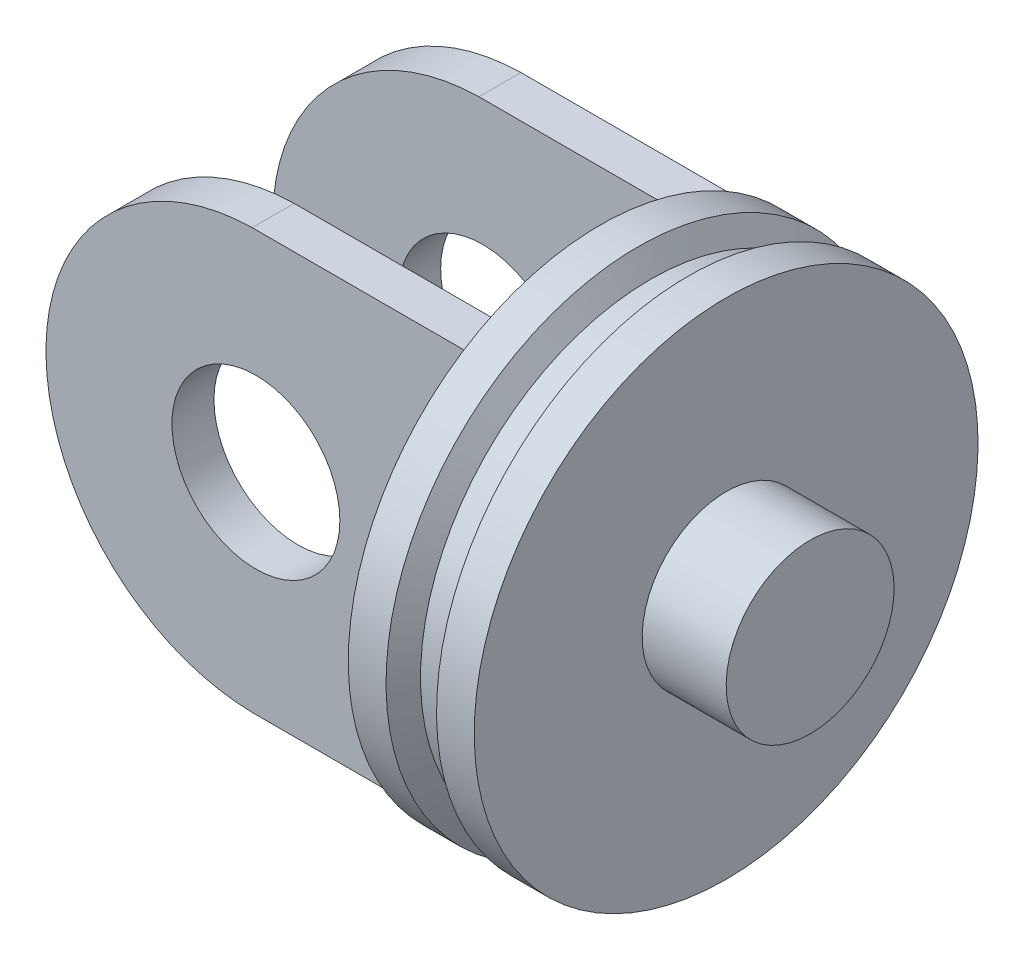
ISO-10303-21;
HEADER;
FILE_DESCRIPTION(('STEP AP214'),'2;1');
FILE_NAME('part.step','',(''),(''),'','','');
FILE_SCHEMA(('AUTOMOTIVE_DESIGN { 1 0 10303 214 1 1 1 1 }'));
ENDSEC;
DATA;
#1=APPLICATION_CONTEXT('core data for automotive mechanical design processes');
#2=APPLICATION_PROTOCOL_DEFINITION('international standard','automotive_design',2000,#1);
#3=PRODUCT_CONTEXT('',#1,'mechanical');
#4=PRODUCT('Part','Part','',(#3));
#5=PRODUCT_RELATED_PRODUCT_CATEGORY('part','',(#4));
#6=PRODUCT_DEFINITION_FORMATION('','',#4);
#7=PRODUCT_DEFINITION_CONTEXT('part definition',#1,'design');
#8=PRODUCT_DEFINITION('design','',#6,#7);
#9=PRODUCT_DEFINITION_SHAPE('','',#8);
#10=(LENGTH_UNIT() NAMED_UNIT(*) SI_UNIT(.MILLI.,.METRE.));
#11=(NAMED_UNIT(*) PLANE_ANGLE_UNIT() SI_UNIT($,.RADIAN.));
#12=(NAMED_UNIT(*) SI_UNIT($,.STERADIAN.) SOLID_ANGLE_UNIT());
#13=UNCERTAINTY_MEASURE_WITH_UNIT(LENGTH_MEASURE(1.E-05),#10,'distance_accuracy_value','');
#14=(GEOMETRIC_REPRESENTATION_CONTEXT(3) GLOBAL_UNCERTAINTY_ASSIGNED_CONTEXT((#13)) GLOBAL_UNIT_ASSIGNED_CONTEXT((#10,
#11,#12)) REPRESENTATION_CONTEXT('',''));
#15=CARTESIAN_POINT('',(0.,0.,0.));
#16=DIRECTION('',(0.,0.,1.));
#17=DIRECTION('',(1.,0.,0.));
#18=AXIS2_PLACEMENT_3D('',#15,#16,#17);
#19=CARTESIAN_POINT('',(-28.75,-12.5,0.));
#20=DIRECTION('',(0.,1.,0.));
#21=DIRECTION('',(-1.,0.,0.));
#22=AXIS2_PLACEMENT_3D('',#19,#20,#21);
#23=PLANE('',#22);
#24=DIRECTION('',(0.,0.,1.));
#25=VECTOR('',#24,1.);
#26=CARTESIAN_POINT('',(-16.4697197970867,-12.5,-17.));
#27=LINE('',#26,#25);
#28=CARTESIAN_POINT('',(-16.4697197970867,-12.5,-8.));
#29=VERTEX_POINT('',#28);
#30=CARTESIAN_POINT('',(-16.4697197970867,-12.5,-5.5));
#31=VERTEX_POINT('',#30);
#32=EDGE_CURVE('E165',#29,#31,#27,.T.);
#33=ORIENTED_EDGE('',*,*,#32,.F.);
#34=DIRECTION('',(1.,0.,0.));
#35=VECTOR('',#34,1.);
#36=CARTESIAN_POINT('',(-28.75,-12.5,-8.));
#37=LINE('',#36,#35);
#38=CARTESIAN_POINT('',(-3.75,-12.5,-8.));
#39=VERTEX_POINT('',#38);
#40=EDGE_CURVE('E199',#29,#39,#37,.T.);
#41=ORIENTED_EDGE('',*,*,#40,.T.);
#42=DIRECTION('',(0.,0.,1.));
#43=VECTOR('',#42,1.);
#44=CARTESIAN_POINT('',(-3.75,-12.5,0.));
#45=LINE('',#44,#43);
#46=CARTESIAN_POINT('',(-3.75,-12.5,-5.5));
#47=VERTEX_POINT('',#46);
#48=EDGE_CURVE('E186',#39,#47,#45,.T.);
#49=ORIENTED_EDGE('',*,*,#48,.T.);
#50=DIRECTION('',(1.,0.,0.));
#51=VECTOR('',#50,1.);
#52=CARTESIAN_POINT('',(-28.75,-12.5,-5.5));
#53=LINE('',#52,#51);
#54=EDGE_CURVE('E215',#31,#47,#53,.T.);
#55=ORIENTED_EDGE('',*,*,#54,.F.);
#56=EDGE_LOOP('',(#33,#41,#49,#55));
#57=FACE_BOUND('',#56,.T.);
#58=ADVANCED_FACE('F67',(#57),#23,.F.);
#59=CARTESIAN_POINT('',(-28.75,0.,-5.5));
#60=DIRECTION('',(0.,0.,-1.));
#61=DIRECTION('',(-1.,0.,0.));
#62=AXIS2_PLACEMENT_3D('',#59,#60,#61);
#63=PLANE('',#62);
#64=CARTESIAN_POINT('',(-16.25,0.,-5.5));
#65=DIRECTION('',(0.,0.,-1.));
#66=DIRECTION('',(-1.,0.,0.));
#67=AXIS2_PLACEMENT_3D('',#64,#65,#66);
#68=CIRCLE('',#67,5.);
#69=CARTESIAN_POINT('',(-21.25,0.,-5.5));
#70=VERTEX_POINT('',#69);
#71=EDGE_CURVE('E271',#70,#70,#68,.T.);
#72=ORIENTED_EDGE('',*,*,#71,.T.);
#73=EDGE_LOOP('',(#72));
#74=FACE_BOUND('',#73,.T.);
#75=CARTESIAN_POINT('',(-16.25,0.,-5.5));
#76=DIRECTION('',(0.,0.,-1.));
#77=DIRECTION('',(-1.,0.,0.));
#78=AXIS2_PLACEMENT_3D('',#75,#76,#77);
#79=CIRCLE('',#78,12.5019309224308);
#80=CARTESIAN_POINT('',(-28.75,-0.219719797086722,-5.5));
#81=VERTEX_POINT('',#80);
#82=EDGE_CURVE('E91',#31,#81,#79,.T.);
#83=ORIENTED_EDGE('',*,*,#82,.F.);
#84=ORIENTED_EDGE('',*,*,#54,.T.);
#85=DIRECTION('',(0.,1.,0.));
#86=VECTOR('',#85,1.);
#87=CARTESIAN_POINT('',(-3.75,0.,-5.5));
#88=LINE('',#87,#86);
#89=CARTESIAN_POINT('',(-3.75,12.5,-5.5));
#90=VERTEX_POINT('',#89);
#91=EDGE_CURVE('E202',#47,#90,#88,.T.);
#92=ORIENTED_EDGE('',*,*,#91,.T.);
#93=DIRECTION('',(1.,0.,0.));
#94=VECTOR('',#93,1.);
#95=CARTESIAN_POINT('',(-28.75,12.5,-5.5));
#96=LINE('',#95,#94);
#97=CARTESIAN_POINT('',(-16.4697197970872,12.5,-5.5));
#98=VERTEX_POINT('',#97);
#99=EDGE_CURVE('E213',#98,#90,#96,.T.);
#100=ORIENTED_EDGE('',*,*,#99,.F.);
#101=CARTESIAN_POINT('',(-16.25,0.,-5.5));
#102=DIRECTION('',(0.,0.,-1.));
#103=DIRECTION('',(-1.,0.,0.));
#104=AXIS2_PLACEMENT_3D('',#101,#102,#103);
#105=CIRCLE('',#104,12.5019309224308);
#106=CARTESIAN_POINT('',(-28.75,0.219719797086724,-5.5));
#107=VERTEX_POINT('',#106);
#108=EDGE_CURVE('E298',#107,#98,#105,.T.);
#109=ORIENTED_EDGE('',*,*,#108,.F.);
#110=DIRECTION('',(0.,1.,0.));
#111=VECTOR('',#110,1.);
#112=CARTESIAN_POINT('',(-28.75,0.,-5.5));
#113=LINE('',#112,#111);
#114=EDGE_CURVE('E192',#81,#107,#113,.T.);
#115=ORIENTED_EDGE('',*,*,#114,.F.);
#116=EDGE_LOOP('',(#83,#84,#92,#100,#109,#115));
#117=FACE_BOUND('',#116,.T.);
#118=ADVANCED_FACE('F314',(#74,#117),#63,.F.);
#119=CARTESIAN_POINT('',(-28.75,12.5,0.));
#120=DIRECTION('',(0.,1.,0.));
#121=DIRECTION('',(-1.,0.,0.));
#122=AXIS2_PLACEMENT_3D('',#119,#120,#121);
#123=PLANE('',#122);
#124=DIRECTION('',(1.,0.,0.));
#125=VECTOR('',#124,1.);
#126=CARTESIAN_POINT('',(-28.75,12.5,-8.));
#127=LINE('',#126,#125);
#128=CARTESIAN_POINT('',(-16.4697197970872,12.5,-8.));
#129=VERTEX_POINT('',#128);
#130=CARTESIAN_POINT('',(-3.75,12.5,-8.));
#131=VERTEX_POINT('',#130);
#132=EDGE_CURVE('E211',#129,#131,#127,.T.);
#133=ORIENTED_EDGE('',*,*,#132,.F.);
#134=DIRECTION('',(0.,0.,1.));
#135=VECTOR('',#134,1.);
#136=CARTESIAN_POINT('',(-16.4697197970872,12.5,-17.));
#137=LINE('',#136,#135);
#138=EDGE_CURVE('E290',#129,#98,#137,.T.);
#139=ORIENTED_EDGE('',*,*,#138,.T.);
#140=ORIENTED_EDGE('',*,*,#99,.T.);
#141=DIRECTION('',(0.,0.,1.));
#142=VECTOR('',#141,1.);
#143=CARTESIAN_POINT('',(-3.75,12.5,0.));
#144=LINE('',#143,#142);
#145=EDGE_CURVE('E205',#131,#90,#144,.T.);
#146=ORIENTED_EDGE('',*,*,#145,.F.);
#147=EDGE_LOOP('',(#133,#139,#140,#146));
#148=FACE_BOUND('',#147,.T.);
#149=ADVANCED_FACE('F336',(#148),#123,.T.);
#150=CARTESIAN_POINT('',(-28.75,0.,-8.));
#151=DIRECTION('',(0.,0.,-1.));
#152=DIRECTION('',(-1.,0.,0.));
#153=AXIS2_PLACEMENT_3D('',#150,#151,#152);
#154=PLANE('',#153);
#155=CARTESIAN_POINT('',(-16.25,0.,-8.));
#156=DIRECTION('',(0.,0.,-1.));
#157=DIRECTION('',(-1.,0.,0.));
#158=AXIS2_PLACEMENT_3D('',#155,#156,#157);
#159=CIRCLE('',#158,5.);
#160=CARTESIAN_POINT('',(-21.25,0.,-8.));
#161=VERTEX_POINT('',#160);
#162=EDGE_CURVE('E307',#161,#161,#159,.T.);
#163=ORIENTED_EDGE('',*,*,#162,.F.);
#164=EDGE_LOOP('',(#163));
#165=FACE_BOUND('',#164,.T.);
#166=ORIENTED_EDGE('',*,*,#40,.F.);
#167=CARTESIAN_POINT('',(-16.25,0.,-8.));
#168=DIRECTION('',(0.,0.,-1.));
#169=DIRECTION('',(-1.,0.,0.));
#170=AXIS2_PLACEMENT_3D('',#167,#168,#169);
#171=CIRCLE('',#170,12.5019309224308);
#172=CARTESIAN_POINT('',(-28.75,-0.219719797086722,-8.));
#173=VERTEX_POINT('',#172);
#174=EDGE_CURVE('E301',#29,#173,#171,.T.);
#175=ORIENTED_EDGE('',*,*,#174,.T.);
#176=DIRECTION('',(0.,1.,0.));
#177=VECTOR('',#176,1.);
#178=CARTESIAN_POINT('',(-28.75,0.,-8.));
#179=LINE('',#178,#177);
#180=CARTESIAN_POINT('',(-28.75,0.219719797086724,-8.));
#181=VERTEX_POINT('',#180);
#182=EDGE_CURVE('E195',#173,#181,#179,.T.);
#183=ORIENTED_EDGE('',*,*,#182,.T.);
#184=CARTESIAN_POINT('',(-16.25,0.,-8.));
#185=DIRECTION('',(0.,0.,-1.));
#186=DIRECTION('',(-1.,0.,0.));
#187=AXIS2_PLACEMENT_3D('',#184,#185,#186);
#188=CIRCLE('',#187,12.5019309224308);
#189=EDGE_CURVE('E83',#181,#129,#188,.T.);
#190=ORIENTED_EDGE('',*,*,#189,.T.);
#191=ORIENTED_EDGE('',*,*,#132,.T.);
#192=DIRECTION('',(0.,1.,0.));
#193=VECTOR('',#192,1.);
#194=CARTESIAN_POINT('',(-3.75,0.,-8.));
#195=LINE('',#194,#193);
#196=EDGE_CURVE('E196',#39,#131,#195,.T.);
#197=ORIENTED_EDGE('',*,*,#196,.F.);
#198=EDGE_LOOP('',(#166,#175,#183,#190,#191,#197));
#199=FACE_BOUND('',#198,.T.);
#200=ADVANCED_FACE('F455',(#165,#199),#154,.T.);
#201=CARTESIAN_POINT('',(-28.75,0.,0.));
#202=DIRECTION('',(-1.,0.,0.));
#203=DIRECTION('',(0.,-1.,0.));
#204=AXIS2_PLACEMENT_3D('',#201,#202,#203);
#205=PLANE('',#204);
#206=ORIENTED_EDGE('',*,*,#182,.F.);
#207=DIRECTION('',(0.,0.,1.));
#208=VECTOR('',#207,1.);
#209=CARTESIAN_POINT('',(-28.75,-0.219719797086722,-17.));
#210=LINE('',#209,#208);
#211=EDGE_CURVE('E166',#173,#81,#210,.T.);
#212=ORIENTED_EDGE('',*,*,#211,.T.);
#213=ORIENTED_EDGE('',*,*,#114,.T.);
#214=DIRECTION('',(0.,0.,1.));
#215=VECTOR('',#214,1.);
#216=CARTESIAN_POINT('',(-28.75,0.219719797086724,-17.));
#217=LINE('',#216,#215);
#218=EDGE_CURVE('E294',#181,#107,#217,.T.);
#219=ORIENTED_EDGE('',*,*,#218,.F.);
#220=EDGE_LOOP('',(#206,#212,#213,#219));
#221=FACE_BOUND('',#220,.T.);
#222=ADVANCED_FACE('F464',(#221),#205,.T.);
#223=CARTESIAN_POINT('',(-28.75,0.,5.5));
#224=DIRECTION('',(0.,0.,-1.));
#225=DIRECTION('',(-1.,0.,0.));
#226=AXIS2_PLACEMENT_3D('',#223,#224,#225);
#227=PLANE('',#226);
#228=CARTESIAN_POINT('',(-16.25,0.,5.5));
#229=DIRECTION('',(0.,0.,-1.));
#230=DIRECTION('',(-1.,0.,0.));
#231=AXIS2_PLACEMENT_3D('',#228,#229,#230);
#232=CIRCLE('',#231,5.);
#233=CARTESIAN_POINT('',(-21.25,0.,5.5));
#234=VERTEX_POINT('',#233);
#235=EDGE_CURVE('E305',#234,#234,#232,.T.);
#236=ORIENTED_EDGE('',*,*,#235,.F.);
#237=EDGE_LOOP('',(#236));
#238=FACE_BOUND('',#237,.T.);
#239=DIRECTION('',(1.,0.,0.));
#240=VECTOR('',#239,1.);
#241=CARTESIAN_POINT('',(-28.75,-12.5,5.5));
#242=LINE('',#241,#240);
#243=CARTESIAN_POINT('',(-16.4697197970867,-12.5,5.50000000000001));
#244=VERTEX_POINT('',#243);
#245=CARTESIAN_POINT('',(-3.75,-12.5,5.5));
#246=VERTEX_POINT('',#245);
#247=EDGE_CURVE('E183',#244,#246,#242,.T.);
#248=ORIENTED_EDGE('',*,*,#247,.F.);
#249=CARTESIAN_POINT('',(-16.25,0.,5.5));
#250=DIRECTION('',(0.,0.,-1.));
#251=DIRECTION('',(-1.,0.,0.));
#252=AXIS2_PLACEMENT_3D('',#249,#250,#251);
#253=CIRCLE('',#252,12.5019309224308);
#254=CARTESIAN_POINT('',(-28.75,-0.219719797086722,5.50000000000001));
#255=VERTEX_POINT('',#254);
#256=EDGE_CURVE('E161',#244,#255,#253,.T.);
#257=ORIENTED_EDGE('',*,*,#256,.T.);
#258=DIRECTION('',(0.,1.,0.));
#259=VECTOR('',#258,1.);
#260=CARTESIAN_POINT('',(-28.75,0.,5.5));
#261=LINE('',#260,#259);
#262=CARTESIAN_POINT('',(-28.75,0.219719797086724,5.5));
#263=VERTEX_POINT('',#262);
#264=EDGE_CURVE('E257',#255,#263,#261,.T.);
#265=ORIENTED_EDGE('',*,*,#264,.T.);
#266=CARTESIAN_POINT('',(-16.25,0.,5.5));
#267=DIRECTION('',(0.,0.,-1.));
#268=DIRECTION('',(-1.,0.,0.));
#269=AXIS2_PLACEMENT_3D('',#266,#267,#268);
#270=CIRCLE('',#269,12.5019309224308);
#271=CARTESIAN_POINT('',(-16.4697197970872,12.5,5.50000000000001));
#272=VERTEX_POINT('',#271);
#273=EDGE_CURVE('E262',#263,#272,#270,.T.);
#274=ORIENTED_EDGE('',*,*,#273,.T.);
#275=DIRECTION('',(1.,0.,0.));
#276=VECTOR('',#275,1.);
#277=CARTESIAN_POINT('',(-28.75,12.5,5.5));
#278=LINE('',#277,#276);
#279=CARTESIAN_POINT('',(-3.75,12.5,5.5));
#280=VERTEX_POINT('',#279);
#281=EDGE_CURVE('E188',#272,#280,#278,.T.);
#282=ORIENTED_EDGE('',*,*,#281,.T.);
#283=DIRECTION('',(0.,1.,0.));
#284=VECTOR('',#283,1.);
#285=CARTESIAN_POINT('',(-3.75,0.,5.5));
#286=LINE('',#285,#284);
#287=EDGE_CURVE('E274',#246,#280,#286,.T.);
#288=ORIENTED_EDGE('',*,*,#287,.F.);
#289=EDGE_LOOP('',(#248,#257,#265,#274,#282,#288));
#290=FACE_BOUND('',#289,.T.);
#291=ADVANCED_FACE('F261',(#238,#290),#227,.T.);
#292=CARTESIAN_POINT('',(-28.75,-12.5,0.));
#293=DIRECTION('',(0.,-1.,0.));
#294=DIRECTION('',(1.,0.,0.));
#295=AXIS2_PLACEMENT_3D('',#292,#293,#294);
#296=PLANE('',#295);
#297=DIRECTION('',(1.,0.,0.));
#298=VECTOR('',#297,1.);
#299=CARTESIAN_POINT('',(-28.75,-12.5,8.));
#300=LINE('',#299,#298);
#301=CARTESIAN_POINT('',(-16.4697197970867,-12.5,8.));
#302=VERTEX_POINT('',#301);
#303=CARTESIAN_POINT('',(-3.75,-12.5,8.));
#304=VERTEX_POINT('',#303);
#305=EDGE_CURVE('E172',#302,#304,#300,.T.);
#306=ORIENTED_EDGE('',*,*,#305,.F.);
#307=EDGE_CURVE('E156',#244,#302,#27,.T.);
#308=ORIENTED_EDGE('',*,*,#307,.F.);
#309=ORIENTED_EDGE('',*,*,#247,.T.);
#310=DIRECTION('',(0.,0.,-1.));
#311=VECTOR('',#310,1.);
#312=CARTESIAN_POINT('',(-3.75,-12.5,0.));
#313=LINE('',#312,#311);
#314=EDGE_CURVE('E181',#304,#246,#313,.T.);
#315=ORIENTED_EDGE('',*,*,#314,.F.);
#316=EDGE_LOOP('',(#306,#308,#309,#315));
#317=FACE_BOUND('',#316,.T.);
#318=ADVANCED_FACE('F179',(#317),#296,.T.);
#319=CARTESIAN_POINT('',(-28.75,0.,8.));
#320=DIRECTION('',(0.,0.,-1.));
#321=DIRECTION('',(-1.,0.,0.));
#322=AXIS2_PLACEMENT_3D('',#319,#320,#321);
#323=PLANE('',#322);
#324=CARTESIAN_POINT('',(-16.25,0.,8.));
#325=DIRECTION('',(0.,0.,1.));
#326=DIRECTION('',(1.,0.,0.));
#327=AXIS2_PLACEMENT_3D('',#324,#325,#326);
#328=CIRCLE('',#327,5.);
#329=CARTESIAN_POINT('',(-11.25,0.,8.));
#330=VERTEX_POINT('',#329);
#331=EDGE_CURVE('E177',#330,#330,#328,.T.);
#332=ORIENTED_EDGE('',*,*,#331,.F.);
#333=EDGE_LOOP('',(#332));
#334=FACE_BOUND('',#333,.T.);
#335=CARTESIAN_POINT('',(-16.25,0.,8.));
#336=DIRECTION('',(0.,0.,1.));
#337=DIRECTION('',(1.,0.,0.));
#338=AXIS2_PLACEMENT_3D('',#335,#336,#337);
#339=CIRCLE('',#338,12.5019309224308);
#340=CARTESIAN_POINT('',(-28.75,-0.219719797086722,8.));
#341=VERTEX_POINT('',#340);
#342=EDGE_CURVE('E159',#341,#302,#339,.T.);
#343=ORIENTED_EDGE('',*,*,#342,.T.);
#344=ORIENTED_EDGE('',*,*,#305,.T.);
#345=DIRECTION('',(0.,1.,0.));
#346=VECTOR('',#345,1.);
#347=CARTESIAN_POINT('',(-3.75,0.,8.));
#348=LINE('',#347,#346);
#349=CARTESIAN_POINT('',(-3.75,12.5,8.));
#350=VERTEX_POINT('',#349);
#351=EDGE_CURVE('E268',#304,#350,#348,.T.);
#352=ORIENTED_EDGE('',*,*,#351,.T.);
#353=DIRECTION('',(1.,0.,0.));
#354=VECTOR('',#353,1.);
#355=CARTESIAN_POINT('',(-28.75,12.5,8.));
#356=LINE('',#355,#354);
#357=CARTESIAN_POINT('',(-16.4697197970872,12.5,8.));
#358=VERTEX_POINT('',#357);
#359=EDGE_CURVE('E184',#358,#350,#356,.T.);
#360=ORIENTED_EDGE('',*,*,#359,.F.);
#361=CARTESIAN_POINT('',(-16.25,0.,8.));
#362=DIRECTION('',(0.,0.,1.));
#363=DIRECTION('',(1.,0.,0.));
#364=AXIS2_PLACEMENT_3D('',#361,#362,#363);
#365=CIRCLE('',#364,12.5019309224308);
#366=CARTESIAN_POINT('',(-28.75,0.219719797086724,8.));
#367=VERTEX_POINT('',#366);
#368=EDGE_CURVE('E287',#358,#367,#365,.T.);
#369=ORIENTED_EDGE('',*,*,#368,.T.);
#370=DIRECTION('',(0.,1.,0.));
#371=VECTOR('',#370,1.);
#372=CARTESIAN_POINT('',(-28.75,0.,8.));
#373=LINE('',#372,#371);
#374=EDGE_CURVE('E176',#341,#367,#373,.T.);
#375=ORIENTED_EDGE('',*,*,#374,.F.);
#376=EDGE_LOOP('',(#343,#344,#352,#360,#369,#375));
#377=FACE_BOUND('',#376,.T.);
#378=ADVANCED_FACE('F170',(#334,#377),#323,.F.);
#379=CARTESIAN_POINT('',(-28.75,12.5,0.));
#380=DIRECTION('',(0.,-1.,0.));
#381=DIRECTION('',(1.,0.,0.));
#382=AXIS2_PLACEMENT_3D('',#379,#380,#381);
#383=PLANE('',#382);
#384=EDGE_CURVE('E288',#272,#358,#137,.T.);
#385=ORIENTED_EDGE('',*,*,#384,.T.);
#386=ORIENTED_EDGE('',*,*,#359,.T.);
#387=DIRECTION('',(0.,0.,-1.));
#388=VECTOR('',#387,1.);
#389=CARTESIAN_POINT('',(-3.75,12.5,0.));
#390=LINE('',#389,#388);
#391=EDGE_CURVE('E264',#350,#280,#390,.T.);
#392=ORIENTED_EDGE('',*,*,#391,.T.);
#393=ORIENTED_EDGE('',*,*,#281,.F.);
#394=EDGE_LOOP('',(#385,#386,#392,#393));
#395=FACE_BOUND('',#394,.T.);
#396=ADVANCED_FACE('F282',(#395),#383,.F.);
#397=CARTESIAN_POINT('',(-28.75,0.,0.));
#398=DIRECTION('',(-1.,0.,0.));
#399=DIRECTION('',(0.,-1.,0.));
#400=AXIS2_PLACEMENT_3D('',#397,#398,#399);
#401=PLANE('',#400);
#402=ORIENTED_EDGE('',*,*,#264,.F.);
#403=DIRECTION('',(0.,0.,1.));
#404=VECTOR('',#403,1.);
#405=CARTESIAN_POINT('',(-28.75,-0.219719797086722,-17.));
#406=LINE('',#405,#404);
#407=EDGE_CURVE('E12',#255,#341,#406,.T.);
#408=ORIENTED_EDGE('',*,*,#407,.T.);
#409=ORIENTED_EDGE('',*,*,#374,.T.);
#410=DIRECTION('',(0.,0.,1.));
#411=VECTOR('',#410,1.);
#412=CARTESIAN_POINT('',(-28.75,0.219719797086724,-17.));
#413=LINE('',#412,#411);
#414=EDGE_CURVE('E76',#367,#263,#413,.F.);
#415=ORIENTED_EDGE('',*,*,#414,.T.);
#416=EDGE_LOOP('',(#402,#408,#409,#415));
#417=FACE_BOUND('',#416,.T.);
#418=ADVANCED_FACE('F256',(#417),#401,.T.);
#419=CARTESIAN_POINT('',(-3.75,0.,0.));
#420=DIRECTION('',(-1.,0.,0.));
#421=DIRECTION('',(0.,-1.,0.));
#422=AXIS2_PLACEMENT_3D('',#419,#420,#421);
#423=PLANE('',#422);
#424=ORIENTED_EDGE('',*,*,#287,.T.);
#425=ORIENTED_EDGE('',*,*,#391,.F.);
#426=ORIENTED_EDGE('',*,*,#351,.F.);
#427=ORIENTED_EDGE('',*,*,#314,.T.);
#428=EDGE_LOOP('',(#424,#425,#426,#427));
#429=FACE_BOUND('',#428,.T.);
#430=CARTESIAN_POINT('',(-3.75,0.,0.));
#431=DIRECTION('',(-1.,0.,0.));
#432=DIRECTION('',(0.,-1.,0.));
#433=AXIS2_PLACEMENT_3D('',#430,#431,#432);
#434=CIRCLE('',#433,15.);
#435=CARTESIAN_POINT('',(-3.75,-15.,0.));
#436=VERTEX_POINT('',#435);
#437=EDGE_CURVE('E232',#436,#436,#434,.T.);
#438=ORIENTED_EDGE('',*,*,#437,.T.);
#439=EDGE_LOOP('',(#438));
#440=FACE_BOUND('',#439,.T.);
#441=ORIENTED_EDGE('',*,*,#91,.F.);
#442=ORIENTED_EDGE('',*,*,#48,.F.);
#443=ORIENTED_EDGE('',*,*,#196,.T.);
#444=ORIENTED_EDGE('',*,*,#145,.T.);
#445=EDGE_LOOP('',(#441,#442,#443,#444));
#446=FACE_BOUND('',#445,.T.);
#447=ADVANCED_FACE('F285',(#429,#440,#446),#423,.T.);
#448=CARTESIAN_POINT('',(-10.1043716212932,0.,0.));
#449=DIRECTION('',(-1.,0.,0.));
#450=DIRECTION('',(0.,-1.,0.));
#451=AXIS2_PLACEMENT_3D('',#448,#449,#450);
#452=CYLINDRICAL_SURFACE('',#451,13.6977938425588);
#453=CARTESIAN_POINT('',(0.751829075539095,0.,0.));
#454=DIRECTION('',(-1.,0.,0.));
#455=DIRECTION('',(0.,-1.,0.));
#456=AXIS2_PLACEMENT_3D('',#453,#454,#455);
#457=CIRCLE('',#456,13.6977938425588);
#458=CARTESIAN_POINT('',(0.751829075539096,-13.6977938425588,0.));
#459=VERTEX_POINT('',#458);
#460=EDGE_CURVE('E217',#459,#459,#457,.T.);
#461=ORIENTED_EDGE('',*,*,#460,.T.);
#462=EDGE_LOOP('',(#461));
#463=FACE_BOUND('',#462,.T.);
#464=CARTESIAN_POINT('',(-0.751829075539072,0.,0.));
#465=DIRECTION('',(-1.,0.,0.));
#466=DIRECTION('',(0.,-1.,0.));
#467=AXIS2_PLACEMENT_3D('',#464,#465,#466);
#468=CIRCLE('',#467,13.6977938425588);
#469=CARTESIAN_POINT('',(-0.751829075539071,-13.6977938425588,0.));
#470=VERTEX_POINT('',#469);
#471=EDGE_CURVE('E238',#470,#470,#468,.T.);
#472=ORIENTED_EDGE('',*,*,#471,.F.);
#473=EDGE_LOOP('',(#472));
#474=FACE_BOUND('',#473,.T.);
#475=ADVANCED_FACE('F365',(#463,#474),#452,.T.);
#476=CARTESIAN_POINT('',(-1.50365815107816,0.,0.));
#477=DIRECTION('',(-1.,0.,0.));
#478=DIRECTION('',(0.,-1.,0.));
#479=AXIS2_PLACEMENT_3D('',#476,#477,#478);
#480=CONICAL_SURFACE('',#479,15.,1.0471975511966);
#481=ORIENTED_EDGE('',*,*,#471,.T.);
#482=EDGE_LOOP('',(#481));
#483=FACE_BOUND('',#482,.T.);
#484=CARTESIAN_POINT('',(-1.50365815107816,0.,0.));
#485=DIRECTION('',(-1.,0.,0.));
#486=DIRECTION('',(0.,-1.,0.));
#487=AXIS2_PLACEMENT_3D('',#484,#485,#486);
#488=CIRCLE('',#487,15.);
#489=CARTESIAN_POINT('',(-1.50365815107816,-15.,0.));
#490=VERTEX_POINT('',#489);
#491=EDGE_CURVE('E235',#490,#490,#488,.T.);
#492=ORIENTED_EDGE('',*,*,#491,.F.);
#493=EDGE_LOOP('',(#492));
#494=FACE_BOUND('',#493,.T.);
#495=ADVANCED_FACE('F368',(#483,#494),#480,.T.);
#496=CARTESIAN_POINT('',(-10.1043716212932,0.,0.));
#497=DIRECTION('',(-1.,0.,0.));
#498=DIRECTION('',(0.,-1.,0.));
#499=AXIS2_PLACEMENT_3D('',#496,#497,#498);
#500=CYLINDRICAL_SURFACE('',#499,15.);
#501=ORIENTED_EDGE('',*,*,#491,.T.);
#502=EDGE_LOOP('',(#501));
#503=FACE_BOUND('',#502,.T.);
#504=ORIENTED_EDGE('',*,*,#437,.F.);
#505=EDGE_LOOP('',(#504));
#506=FACE_BOUND('',#505,.T.);
#507=ADVANCED_FACE('F361',(#503,#506),#500,.T.);
#508=CARTESIAN_POINT('',(8.75,0.,0.));
#509=DIRECTION('',(1.,0.,0.));
#510=DIRECTION('',(0.,1.,0.));
#511=AXIS2_PLACEMENT_3D('',#508,#509,#510);
#512=PLANE('',#511);
#513=CARTESIAN_POINT('',(8.75,0.,0.));
#514=DIRECTION('',(-1.,0.,0.));
#515=DIRECTION('',(0.,-1.,0.));
#516=AXIS2_PLACEMENT_3D('',#513,#514,#515);
#517=CIRCLE('',#516,5.);
#518=CARTESIAN_POINT('',(8.75,-5.,0.));
#519=VERTEX_POINT('',#518);
#520=EDGE_CURVE('E229',#519,#519,#517,.T.);
#521=ORIENTED_EDGE('',*,*,#520,.F.);
#522=EDGE_LOOP('',(#521));
#523=FACE_BOUND('',#522,.T.);
#524=ADVANCED_FACE('F357',(#523),#512,.T.);
#525=CARTESIAN_POINT('',(-10.1043716212932,0.,0.));
#526=DIRECTION('',(-1.,0.,0.));
#527=DIRECTION('',(0.,-1.,0.));
#528=AXIS2_PLACEMENT_3D('',#525,#526,#527);
#529=CYLINDRICAL_SURFACE('',#528,5.);
#530=ORIENTED_EDGE('',*,*,#520,.T.);
#531=EDGE_LOOP('',(#530));
#532=FACE_BOUND('',#531,.T.);
#533=CARTESIAN_POINT('',(3.74999999999999,0.,0.));
#534=DIRECTION('',(-1.,0.,0.));
#535=DIRECTION('',(0.,-1.,0.));
#536=AXIS2_PLACEMENT_3D('',#533,#534,#535);
#537=CIRCLE('',#536,5.);
#538=CARTESIAN_POINT('',(3.75,-5.,0.));
#539=VERTEX_POINT('',#538);
#540=EDGE_CURVE('E226',#539,#539,#537,.T.);
#541=ORIENTED_EDGE('',*,*,#540,.F.);
#542=EDGE_LOOP('',(#541));
#543=FACE_BOUND('',#542,.T.);
#544=ADVANCED_FACE('F353',(#532,#543),#529,.T.);
#545=CARTESIAN_POINT('',(3.75,0.,0.));
#546=DIRECTION('',(-1.,0.,0.));
#547=DIRECTION('',(0.,-1.,0.));
#548=AXIS2_PLACEMENT_3D('',#545,#546,#547);
#549=PLANE('',#548);
#550=CARTESIAN_POINT('',(3.74999999999999,0.,0.));
#551=DIRECTION('',(-1.,0.,0.));
#552=DIRECTION('',(0.,-1.,0.));
#553=AXIS2_PLACEMENT_3D('',#550,#551,#552);
#554=CIRCLE('',#553,15.);
#555=CARTESIAN_POINT('',(3.75,-15.,0.));
#556=VERTEX_POINT('',#555);
#557=EDGE_CURVE('E223',#556,#556,#554,.T.);
#558=ORIENTED_EDGE('',*,*,#557,.F.);
#559=EDGE_LOOP('',(#558));
#560=FACE_BOUND('',#559,.T.);
#561=ORIENTED_EDGE('',*,*,#540,.T.);
#562=EDGE_LOOP('',(#561));
#563=FACE_BOUND('',#562,.T.);
#564=ADVANCED_FACE('F349',(#560,#563),#549,.F.);
#565=CARTESIAN_POINT('',(-10.1043716212932,0.,0.));
#566=DIRECTION('',(-1.,0.,0.));
#567=DIRECTION('',(0.,-1.,0.));
#568=AXIS2_PLACEMENT_3D('',#565,#566,#567);
#569=CYLINDRICAL_SURFACE('',#568,15.);
#570=ORIENTED_EDGE('',*,*,#557,.T.);
#571=EDGE_LOOP('',(#570));
#572=FACE_BOUND('',#571,.T.);
#573=CARTESIAN_POINT('',(1.50365815107816,0.,0.));
#574=DIRECTION('',(-1.,0.,0.));
#575=DIRECTION('',(0.,-1.,0.));
#576=AXIS2_PLACEMENT_3D('',#573,#574,#575);
#577=CIRCLE('',#576,15.);
#578=CARTESIAN_POINT('',(1.50365815107816,-15.,0.));
#579=VERTEX_POINT('',#578);
#580=EDGE_CURVE('E220',#579,#579,#577,.T.);
#581=ORIENTED_EDGE('',*,*,#580,.F.);
#582=EDGE_LOOP('',(#581));
#583=FACE_BOUND('',#582,.T.);
#584=ADVANCED_FACE('F345',(#572,#583),#569,.T.);
#585=CARTESIAN_POINT('',(0.751829075539095,0.,0.));
#586=DIRECTION('',(1.,0.,0.));
#587=DIRECTION('',(0.,1.,0.));
#588=AXIS2_PLACEMENT_3D('',#585,#586,#587);
#589=CONICAL_SURFACE('',#588,13.6977938425588,1.0471975511966);
#590=ORIENTED_EDGE('',*,*,#580,.T.);
#591=EDGE_LOOP('',(#590));
#592=FACE_BOUND('',#591,.T.);
#593=ORIENTED_EDGE('',*,*,#460,.F.);
#594=EDGE_LOOP('',(#593));
#595=FACE_BOUND('',#594,.T.);
#596=ADVANCED_FACE('F341',(#592,#595),#589,.T.);
#597=CARTESIAN_POINT('',(-16.25,0.,-17.));
#598=DIRECTION('',(0.,0.,1.));
#599=DIRECTION('',(1.,0.,0.));
#600=AXIS2_PLACEMENT_3D('',#597,#598,#599);
#601=CYLINDRICAL_SURFACE('',#600,12.5019309224308);
#602=ORIENTED_EDGE('',*,*,#414,.F.);
#603=ORIENTED_EDGE('',*,*,#368,.F.);
#604=ORIENTED_EDGE('',*,*,#384,.F.);
#605=ORIENTED_EDGE('',*,*,#273,.F.);
#606=EDGE_LOOP('',(#602,#603,#604,#605));
#607=FACE_BOUND('',#606,.T.);
#608=ADVANCED_FACE('F344',(#607),#601,.T.);
#609=CARTESIAN_POINT('',(-16.25,0.,-17.));
#610=DIRECTION('',(0.,0.,1.));
#611=DIRECTION('',(1.,0.,0.));
#612=AXIS2_PLACEMENT_3D('',#609,#610,#611);
#613=CYLINDRICAL_SURFACE('',#612,12.5019309224308);
#614=ORIENTED_EDGE('',*,*,#307,.T.);
#615=ORIENTED_EDGE('',*,*,#342,.F.);
#616=ORIENTED_EDGE('',*,*,#407,.F.);
#617=ORIENTED_EDGE('',*,*,#256,.F.);
#618=EDGE_LOOP('',(#614,#615,#616,#617));
#619=FACE_BOUND('',#618,.T.);
#620=ADVANCED_FACE('F158',(#619),#613,.T.);
#621=CARTESIAN_POINT('',(-16.25,0.,-17.));
#622=DIRECTION('',(0.,0.,1.));
#623=DIRECTION('',(1.,0.,0.));
#624=AXIS2_PLACEMENT_3D('',#621,#622,#623);
#625=CYLINDRICAL_SURFACE('',#624,5.);
#626=ORIENTED_EDGE('',*,*,#235,.T.);
#627=EDGE_LOOP('',(#626));
#628=FACE_BOUND('',#627,.T.);
#629=ORIENTED_EDGE('',*,*,#331,.T.);
#630=EDGE_LOOP('',(#629));
#631=FACE_BOUND('',#630,.T.);
#632=ADVANCED_FACE('F321',(#628,#631),#625,.F.);
#633=ORIENTED_EDGE('',*,*,#108,.T.);
#634=ORIENTED_EDGE('',*,*,#138,.F.);
#635=ORIENTED_EDGE('',*,*,#189,.F.);
#636=ORIENTED_EDGE('',*,*,#218,.T.);
#637=EDGE_LOOP('',(#633,#634,#635,#636));
#638=FACE_BOUND('',#637,.T.);
#639=ADVANCED_FACE('F326',(#638),#601,.T.);
#640=ORIENTED_EDGE('',*,*,#82,.T.);
#641=ORIENTED_EDGE('',*,*,#211,.F.);
#642=ORIENTED_EDGE('',*,*,#174,.F.);
#643=ORIENTED_EDGE('',*,*,#32,.T.);
#644=EDGE_LOOP('',(#640,#641,#642,#643));
#645=FACE_BOUND('',#644,.T.);
#646=ADVANCED_FACE('F319',(#645),#613,.T.);
#647=ORIENTED_EDGE('',*,*,#162,.T.);
#648=EDGE_LOOP('',(#647));
#649=FACE_BOUND('',#648,.T.);
#650=ORIENTED_EDGE('',*,*,#71,.F.);
#651=EDGE_LOOP('',(#650));
#652=FACE_BOUND('',#651,.T.);
#653=ADVANCED_FACE('F317',(#649,#652),#625,.F.);
#654=CLOSED_SHELL('',(#58,#118,#149,#200,#222,#291,#318,#378,#396,#418,#447,#475,#495,#507,#524,
#544,#564,#584,#596,#608,#620,#632,#639,#646,#653));
#655=CARTESIAN_POINT('',(1.50365815107816,0.,0.));
#656=DIRECTION('',(-1.,0.,0.));
#657=DIRECTION('',(0.,-1.,0.));
#658=AXIS2_PLACEMENT_3D('',#655,#656,#657);
#659=PLANE('',#658);
#660=CARTESIAN_POINT('',(1.50365815107816,0.,0.));
#661=DIRECTION('',(-1.,0.,0.));
#662=DIRECTION('',(0.,-1.,0.));
#663=AXIS2_PLACEMENT_3D('',#660,#661,#662);
#664=CIRCLE('',#663,5.);
#665=CARTESIAN_POINT('',(1.50365815107816,-5.,0.));
#666=VERTEX_POINT('',#665);
#667=EDGE_CURVE('E241',#666,#666,#664,.T.);
#668=ORIENTED_EDGE('',*,*,#667,.T.);
#669=EDGE_LOOP('',(#668));
#670=FACE_BOUND('',#669,.T.);
#671=CARTESIAN_POINT('',(1.50365815107816,0.,0.));
#672=DIRECTION('',(-1.,0.,0.));
#673=DIRECTION('',(0.,-1.,0.));
#674=AXIS2_PLACEMENT_3D('',#671,#672,#673);
#675=CIRCLE('',#674,4.38501648646576);
#676=CARTESIAN_POINT('',(1.50365815107816,-4.38501648646576,0.));
#677=VERTEX_POINT('',#676);
#678=EDGE_CURVE('E250',#677,#677,#675,.T.);
#679=ORIENTED_EDGE('',*,*,#678,.F.);
#680=EDGE_LOOP('',(#679));
#681=FACE_BOUND('',#680,.T.);
#682=ADVANCED_FACE('F69',(#670,#681),#659,.T.);
#683=CARTESIAN_POINT('',(-10.1043716212932,0.,0.));
#684=DIRECTION('',(-1.,0.,0.));
#685=DIRECTION('',(0.,-1.,0.));
#686=AXIS2_PLACEMENT_3D('',#683,#684,#685);
#687=CYLINDRICAL_SURFACE('',#686,4.38501648646576);
#688=ORIENTED_EDGE('',*,*,#678,.T.);
#689=EDGE_LOOP('',(#688));
#690=FACE_BOUND('',#689,.T.);
#691=CARTESIAN_POINT('',(-1.5,0.,0.));
#692=DIRECTION('',(-1.,0.,0.));
#693=DIRECTION('',(0.,-1.,0.));
#694=AXIS2_PLACEMENT_3D('',#691,#692,#693);
#695=CIRCLE('',#694,4.38501648646576);
#696=CARTESIAN_POINT('',(-1.5,-4.38501648646576,0.));
#697=VERTEX_POINT('',#696);
#698=EDGE_CURVE('E247',#697,#697,#695,.T.);
#699=ORIENTED_EDGE('',*,*,#698,.F.);
#700=EDGE_LOOP('',(#699));
#701=FACE_BOUND('',#700,.T.);
#702=ADVANCED_FACE('F383',(#690,#701),#687,.T.);
#703=CARTESIAN_POINT('',(-1.5,0.,0.));
#704=DIRECTION('',(-1.,0.,0.));
#705=DIRECTION('',(0.,-1.,0.));
#706=AXIS2_PLACEMENT_3D('',#703,#704,#705);
#707=PLANE('',#706);
#708=CARTESIAN_POINT('',(-1.5,0.,0.));
#709=DIRECTION('',(-1.,0.,0.));
#710=DIRECTION('',(0.,-1.,0.));
#711=AXIS2_PLACEMENT_3D('',#708,#709,#710);
#712=CIRCLE('',#711,5.);
#713=CARTESIAN_POINT('',(-1.5,-5.,0.));
#714=VERTEX_POINT('',#713);
#715=EDGE_CURVE('E244',#714,#714,#712,.T.);
#716=ORIENTED_EDGE('',*,*,#715,.F.);
#717=EDGE_LOOP('',(#716));
#718=FACE_BOUND('',#717,.T.);
#719=ORIENTED_EDGE('',*,*,#698,.T.);
#720=EDGE_LOOP('',(#719));
#721=FACE_BOUND('',#720,.T.);
#722=ADVANCED_FACE('F379',(#718,#721),#707,.F.);
#723=CARTESIAN_POINT('',(-10.1043716212932,0.,0.));
#724=DIRECTION('',(-1.,0.,0.));
#725=DIRECTION('',(0.,-1.,0.));
#726=AXIS2_PLACEMENT_3D('',#723,#724,#725);
#727=CYLINDRICAL_SURFACE('',#726,5.);
#728=ORIENTED_EDGE('',*,*,#667,.F.);
#729=EDGE_LOOP('',(#728));
#730=FACE_BOUND('',#729,.T.);
#731=ORIENTED_EDGE('',*,*,#715,.T.);
#732=EDGE_LOOP('',(#731));
#733=FACE_BOUND('',#732,.T.);
#734=ADVANCED_FACE('F376',(#730,#733),#727,.F.);
#735=CLOSED_SHELL('',(#682,#702,#722,#734));
#736=ORIENTED_CLOSED_SHELL('',*,#735,.T.);
#737=BREP_WITH_VOIDS('B2',#654,(#736));
#738=ADVANCED_BREP_SHAPE_REPRESENTATION('',(#18,#737),#14);
#739=SHAPE_DEFINITION_REPRESENTATION(#9,#738);
ENDSEC;
END-ISO-10303-21;
